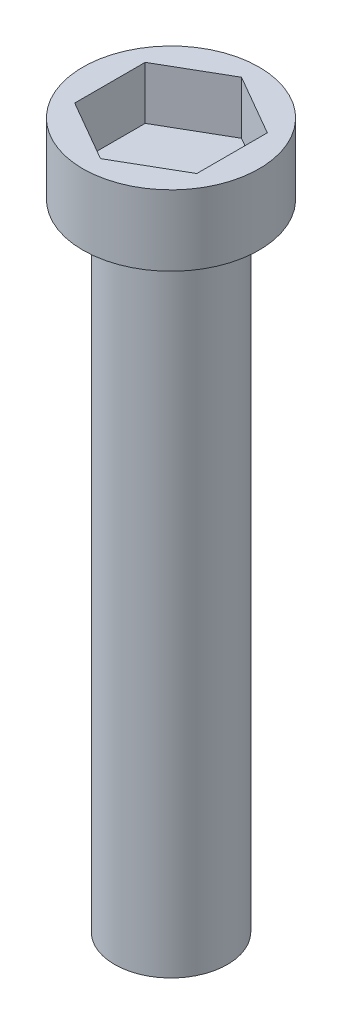
ISO-10303-21;
HEADER;
FILE_DESCRIPTION(('STEP AP214'),'2;1');
FILE_NAME('part.step','',(''),(''),'','','');
FILE_SCHEMA(('AUTOMOTIVE_DESIGN { 1 0 10303 214 1 1 1 1 }'));
ENDSEC;
DATA;
#1=APPLICATION_CONTEXT('core data for automotive mechanical design processes');
#2=APPLICATION_PROTOCOL_DEFINITION('international standard','automotive_design',2000,#1);
#3=PRODUCT_CONTEXT('',#1,'mechanical');
#4=PRODUCT('Part','Part','',(#3));
#5=PRODUCT_RELATED_PRODUCT_CATEGORY('part','',(#4));
#6=PRODUCT_DEFINITION_FORMATION('','',#4);
#7=PRODUCT_DEFINITION_CONTEXT('part definition',#1,'design');
#8=PRODUCT_DEFINITION('design','',#6,#7);
#9=PRODUCT_DEFINITION_SHAPE('','',#8);
#10=(LENGTH_UNIT() NAMED_UNIT(*) SI_UNIT(.MILLI.,.METRE.));
#11=(NAMED_UNIT(*) PLANE_ANGLE_UNIT() SI_UNIT($,.RADIAN.));
#12=(NAMED_UNIT(*) SI_UNIT($,.STERADIAN.) SOLID_ANGLE_UNIT());
#13=UNCERTAINTY_MEASURE_WITH_UNIT(LENGTH_MEASURE(1.E-05),#10,'distance_accuracy_value','');
#14=(GEOMETRIC_REPRESENTATION_CONTEXT(3) GLOBAL_UNCERTAINTY_ASSIGNED_CONTEXT((#13)) GLOBAL_UNIT_ASSIGNED_CONTEXT((#10,
#11,#12)) REPRESENTATION_CONTEXT('',''));
#15=CARTESIAN_POINT('',(0.,0.,0.));
#16=DIRECTION('',(0.,0.,1.));
#17=DIRECTION('',(1.,0.,0.));
#18=AXIS2_PLACEMENT_3D('',#15,#16,#17);
#19=CARTESIAN_POINT('',(0.,18.,0.));
#20=DIRECTION('',(0.,-1.,0.));
#21=DIRECTION('',(0.,0.,-1.));
#22=AXIS2_PLACEMENT_3D('',#19,#20,#21);
#23=CYLINDRICAL_SURFACE('',#22,1.6);
#24=CARTESIAN_POINT('',(0.,18.,0.));
#25=DIRECTION('',(0.,1.,0.));
#26=DIRECTION('',(0.,0.,1.));
#27=AXIS2_PLACEMENT_3D('',#24,#25,#26);
#28=CIRCLE('',#27,1.6);
#29=CARTESIAN_POINT('',(0.,18.,1.6));
#30=VERTEX_POINT('',#29);
#31=EDGE_CURVE('E11',#30,#30,#28,.T.);
#32=ORIENTED_EDGE('',*,*,#31,.F.);
#33=EDGE_LOOP('',(#32));
#34=FACE_BOUND('',#33,.T.);
#35=CARTESIAN_POINT('',(0.,0.,0.));
#36=DIRECTION('',(0.,1.,0.));
#37=DIRECTION('',(0.,0.,1.));
#38=AXIS2_PLACEMENT_3D('',#35,#36,#37);
#39=CIRCLE('',#38,1.6);
#40=CARTESIAN_POINT('',(0.,0.,1.6));
#41=VERTEX_POINT('',#40);
#42=EDGE_CURVE('E42',#41,#41,#39,.T.);
#43=ORIENTED_EDGE('',*,*,#42,.T.);
#44=EDGE_LOOP('',(#43));
#45=FACE_BOUND('',#44,.T.);
#46=ADVANCED_FACE('F39',(#34,#45),#23,.T.);
#47=CARTESIAN_POINT('',(0.,0.,0.));
#48=DIRECTION('',(0.,1.,0.));
#49=DIRECTION('',(0.,0.,1.));
#50=AXIS2_PLACEMENT_3D('',#47,#48,#49);
#51=PLANE('',#50);
#52=ORIENTED_EDGE('',*,*,#42,.F.);
#53=EDGE_LOOP('',(#52));
#54=FACE_BOUND('',#53,.T.);
#55=ADVANCED_FACE('F171',(#54),#51,.F.);
#56=CARTESIAN_POINT('',(0.,20.,0.));
#57=DIRECTION('',(0.,-1.,0.));
#58=DIRECTION('',(0.,0.,-1.));
#59=AXIS2_PLACEMENT_3D('',#56,#57,#58);
#60=CYLINDRICAL_SURFACE('',#59,2.5);
#61=CARTESIAN_POINT('',(0.,20.,0.));
#62=DIRECTION('',(0.,1.,0.));
#63=DIRECTION('',(0.,0.,1.));
#64=AXIS2_PLACEMENT_3D('',#61,#62,#63);
#65=CIRCLE('',#64,2.5);
#66=CARTESIAN_POINT('',(0.,20.,2.5));
#67=VERTEX_POINT('',#66);
#68=EDGE_CURVE('E146',#67,#67,#65,.T.);
#69=ORIENTED_EDGE('',*,*,#68,.F.);
#70=EDGE_LOOP('',(#69));
#71=FACE_BOUND('',#70,.T.);
#72=CARTESIAN_POINT('',(0.,18.,0.));
#73=DIRECTION('',(0.,1.,0.));
#74=DIRECTION('',(0.,0.,1.));
#75=AXIS2_PLACEMENT_3D('',#72,#73,#74);
#76=CIRCLE('',#75,2.5);
#77=CARTESIAN_POINT('',(0.,18.,2.5));
#78=VERTEX_POINT('',#77);
#79=EDGE_CURVE('E140',#78,#78,#76,.T.);
#80=ORIENTED_EDGE('',*,*,#79,.T.);
#81=EDGE_LOOP('',(#80));
#82=FACE_BOUND('',#81,.T.);
#83=ADVANCED_FACE('F152',(#71,#82),#60,.T.);
#84=CARTESIAN_POINT('',(0.,20.,0.));
#85=DIRECTION('',(0.,1.,0.));
#86=DIRECTION('',(0.,0.,1.));
#87=AXIS2_PLACEMENT_3D('',#84,#85,#86);
#88=PLANE('',#87);
#89=DIRECTION('',(-0.866025403784439,0.,-0.5));
#90=VECTOR('',#89,1.);
#91=CARTESIAN_POINT('',(1.73205080756888,20.,-1.));
#92=LINE('',#91,#90);
#93=CARTESIAN_POINT('',(1.73205080756888,20.,-1.));
#94=VERTEX_POINT('',#93);
#95=CARTESIAN_POINT('',(0.,20.,-2.));
#96=VERTEX_POINT('',#95);
#97=EDGE_CURVE('E53',#94,#96,#92,.T.);
#98=ORIENTED_EDGE('',*,*,#97,.F.);
#99=DIRECTION('',(0.,0.,-1.));
#100=VECTOR('',#99,1.);
#101=CARTESIAN_POINT('',(1.73205080756888,20.,1.));
#102=LINE('',#101,#100);
#103=CARTESIAN_POINT('',(1.73205080756888,20.,1.));
#104=VERTEX_POINT('',#103);
#105=EDGE_CURVE('E136',#104,#94,#102,.T.);
#106=ORIENTED_EDGE('',*,*,#105,.F.);
#107=DIRECTION('',(0.866025403784439,0.,-0.5));
#108=VECTOR('',#107,1.);
#109=CARTESIAN_POINT('',(0.,20.,2.));
#110=LINE('',#109,#108);
#111=CARTESIAN_POINT('',(0.,20.,2.));
#112=VERTEX_POINT('',#111);
#113=EDGE_CURVE('E134',#112,#104,#110,.T.);
#114=ORIENTED_EDGE('',*,*,#113,.F.);
#115=DIRECTION('',(0.866025403784439,0.,0.5));
#116=VECTOR('',#115,1.);
#117=CARTESIAN_POINT('',(-1.73205080756888,20.,1.));
#118=LINE('',#117,#116);
#119=CARTESIAN_POINT('',(-1.73205080756888,20.,1.));
#120=VERTEX_POINT('',#119);
#121=EDGE_CURVE('E101',#120,#112,#118,.T.);
#122=ORIENTED_EDGE('',*,*,#121,.F.);
#123=DIRECTION('',(0.,0.,1.));
#124=VECTOR('',#123,1.);
#125=CARTESIAN_POINT('',(-1.73205080756888,20.,-1.));
#126=LINE('',#125,#124);
#127=CARTESIAN_POINT('',(-1.73205080756888,20.,-1.));
#128=VERTEX_POINT('',#127);
#129=EDGE_CURVE('E130',#128,#120,#126,.T.);
#130=ORIENTED_EDGE('',*,*,#129,.F.);
#131=DIRECTION('',(-0.866025403784439,0.,0.5));
#132=VECTOR('',#131,1.);
#133=CARTESIAN_POINT('',(0.,20.,-2.));
#134=LINE('',#133,#132);
#135=EDGE_CURVE('E127',#96,#128,#134,.T.);
#136=ORIENTED_EDGE('',*,*,#135,.F.);
#137=EDGE_LOOP('',(#98,#106,#114,#122,#130,#136));
#138=FACE_BOUND('',#137,.T.);
#139=ORIENTED_EDGE('',*,*,#68,.T.);
#140=EDGE_LOOP('',(#139));
#141=FACE_BOUND('',#140,.T.);
#142=ADVANCED_FACE('F157',(#138,#141),#88,.T.);
#143=CARTESIAN_POINT('',(0.,18.,0.));
#144=DIRECTION('',(0.,1.,0.));
#145=DIRECTION('',(0.,0.,1.));
#146=AXIS2_PLACEMENT_3D('',#143,#144,#145);
#147=PLANE('',#146);
#148=ORIENTED_EDGE('',*,*,#31,.T.);
#149=EDGE_LOOP('',(#148));
#150=FACE_BOUND('',#149,.T.);
#151=ORIENTED_EDGE('',*,*,#79,.F.);
#152=EDGE_LOOP('',(#151));
#153=FACE_BOUND('',#152,.T.);
#154=ADVANCED_FACE('F154',(#150,#153),#147,.F.);
#155=CARTESIAN_POINT('',(1.73205080756888,18.5,-1.));
#156=DIRECTION('',(0.5,0.,-0.866025403784439));
#157=DIRECTION('',(-0.866025403784439,0.,-0.5));
#158=AXIS2_PLACEMENT_3D('',#155,#156,#157);
#159=PLANE('',#158);
#160=ORIENTED_EDGE('',*,*,#97,.T.);
#161=DIRECTION('',(0.,1.,0.));
#162=VECTOR('',#161,1.);
#163=CARTESIAN_POINT('',(0.,18.5,-2.));
#164=LINE('',#163,#162);
#165=CARTESIAN_POINT('',(0.,18.5,-2.));
#166=VERTEX_POINT('',#165);
#167=EDGE_CURVE('E83',#166,#96,#164,.T.);
#168=ORIENTED_EDGE('',*,*,#167,.F.);
#169=DIRECTION('',(-0.866025403784439,0.,-0.5));
#170=VECTOR('',#169,1.);
#171=CARTESIAN_POINT('',(1.73205080756888,18.5,-1.));
#172=LINE('',#171,#170);
#173=CARTESIAN_POINT('',(1.73205080756888,18.5,-1.));
#174=VERTEX_POINT('',#173);
#175=EDGE_CURVE('E138',#174,#166,#172,.T.);
#176=ORIENTED_EDGE('',*,*,#175,.F.);
#177=DIRECTION('',(0.,1.,0.));
#178=VECTOR('',#177,1.);
#179=CARTESIAN_POINT('',(1.73205080756888,18.5,-1.));
#180=LINE('',#179,#178);
#181=EDGE_CURVE('E61',#174,#94,#180,.T.);
#182=ORIENTED_EDGE('',*,*,#181,.T.);
#183=EDGE_LOOP('',(#160,#168,#176,#182));
#184=FACE_BOUND('',#183,.T.);
#185=ADVANCED_FACE('F156',(#184),#159,.F.);
#186=CARTESIAN_POINT('',(1.73205080756888,18.5,1.));
#187=DIRECTION('',(1.,0.,0.));
#188=DIRECTION('',(0.,0.,-1.));
#189=AXIS2_PLACEMENT_3D('',#186,#187,#188);
#190=PLANE('',#189);
#191=ORIENTED_EDGE('',*,*,#105,.T.);
#192=ORIENTED_EDGE('',*,*,#181,.F.);
#193=DIRECTION('',(0.,0.,-1.));
#194=VECTOR('',#193,1.);
#195=CARTESIAN_POINT('',(1.73205080756888,18.5,1.));
#196=LINE('',#195,#194);
#197=CARTESIAN_POINT('',(1.73205080756888,18.5,1.));
#198=VERTEX_POINT('',#197);
#199=EDGE_CURVE('E113',#198,#174,#196,.T.);
#200=ORIENTED_EDGE('',*,*,#199,.F.);
#201=DIRECTION('',(0.,1.,0.));
#202=VECTOR('',#201,1.);
#203=CARTESIAN_POINT('',(1.73205080756888,18.5,1.));
#204=LINE('',#203,#202);
#205=EDGE_CURVE('E105',#198,#104,#204,.T.);
#206=ORIENTED_EDGE('',*,*,#205,.T.);
#207=EDGE_LOOP('',(#191,#192,#200,#206));
#208=FACE_BOUND('',#207,.T.);
#209=ADVANCED_FACE('F165',(#208),#190,.F.);
#210=CARTESIAN_POINT('',(0.,18.5,2.));
#211=DIRECTION('',(0.5,0.,0.866025403784439));
#212=DIRECTION('',(0.866025403784439,0.,-0.5));
#213=AXIS2_PLACEMENT_3D('',#210,#211,#212);
#214=PLANE('',#213);
#215=ORIENTED_EDGE('',*,*,#113,.T.);
#216=ORIENTED_EDGE('',*,*,#205,.F.);
#217=DIRECTION('',(0.866025403784439,0.,-0.5));
#218=VECTOR('',#217,1.);
#219=CARTESIAN_POINT('',(0.,18.5,2.));
#220=LINE('',#219,#218);
#221=CARTESIAN_POINT('',(0.,18.5,2.));
#222=VERTEX_POINT('',#221);
#223=EDGE_CURVE('E109',#222,#198,#220,.T.);
#224=ORIENTED_EDGE('',*,*,#223,.F.);
#225=DIRECTION('',(0.,1.,0.));
#226=VECTOR('',#225,1.);
#227=CARTESIAN_POINT('',(0.,18.5,2.));
#228=LINE('',#227,#226);
#229=EDGE_CURVE('E94',#222,#112,#228,.T.);
#230=ORIENTED_EDGE('',*,*,#229,.T.);
#231=EDGE_LOOP('',(#215,#216,#224,#230));
#232=FACE_BOUND('',#231,.T.);
#233=ADVANCED_FACE('F110',(#232),#214,.F.);
#234=CARTESIAN_POINT('',(-1.73205080756888,18.5,1.));
#235=DIRECTION('',(-0.5,0.,0.866025403784439));
#236=DIRECTION('',(0.866025403784439,0.,0.5));
#237=AXIS2_PLACEMENT_3D('',#234,#235,#236);
#238=PLANE('',#237);
#239=ORIENTED_EDGE('',*,*,#121,.T.);
#240=ORIENTED_EDGE('',*,*,#229,.F.);
#241=DIRECTION('',(0.866025403784439,0.,0.5));
#242=VECTOR('',#241,1.);
#243=CARTESIAN_POINT('',(-1.73205080756888,18.5,1.));
#244=LINE('',#243,#242);
#245=CARTESIAN_POINT('',(-1.73205080756888,18.5,1.));
#246=VERTEX_POINT('',#245);
#247=EDGE_CURVE('E98',#246,#222,#244,.T.);
#248=ORIENTED_EDGE('',*,*,#247,.F.);
#249=DIRECTION('',(0.,1.,0.));
#250=VECTOR('',#249,1.);
#251=CARTESIAN_POINT('',(-1.73205080756888,18.5,1.));
#252=LINE('',#251,#250);
#253=EDGE_CURVE('E106',#246,#120,#252,.T.);
#254=ORIENTED_EDGE('',*,*,#253,.T.);
#255=EDGE_LOOP('',(#239,#240,#248,#254));
#256=FACE_BOUND('',#255,.T.);
#257=ADVANCED_FACE('F96',(#256),#238,.F.);
#258=CARTESIAN_POINT('',(-1.73205080756888,18.5,-1.));
#259=DIRECTION('',(-1.,0.,0.));
#260=DIRECTION('',(0.,0.,1.));
#261=AXIS2_PLACEMENT_3D('',#258,#259,#260);
#262=PLANE('',#261);
#263=ORIENTED_EDGE('',*,*,#129,.T.);
#264=ORIENTED_EDGE('',*,*,#253,.F.);
#265=DIRECTION('',(0.,0.,1.));
#266=VECTOR('',#265,1.);
#267=CARTESIAN_POINT('',(-1.73205080756888,18.5,-1.));
#268=LINE('',#267,#266);
#269=CARTESIAN_POINT('',(-1.73205080756888,18.5,-1.));
#270=VERTEX_POINT('',#269);
#271=EDGE_CURVE('E119',#270,#246,#268,.T.);
#272=ORIENTED_EDGE('',*,*,#271,.F.);
#273=DIRECTION('',(0.,1.,0.));
#274=VECTOR('',#273,1.);
#275=CARTESIAN_POINT('',(-1.73205080756888,18.5,-1.));
#276=LINE('',#275,#274);
#277=EDGE_CURVE('E143',#270,#128,#276,.T.);
#278=ORIENTED_EDGE('',*,*,#277,.T.);
#279=EDGE_LOOP('',(#263,#264,#272,#278));
#280=FACE_BOUND('',#279,.T.);
#281=ADVANCED_FACE('F233',(#280),#262,.F.);
#282=CARTESIAN_POINT('',(0.,18.5,-2.));
#283=DIRECTION('',(-0.5,0.,-0.866025403784438));
#284=DIRECTION('',(-0.866025403784439,0.,0.5));
#285=AXIS2_PLACEMENT_3D('',#282,#283,#284);
#286=PLANE('',#285);
#287=ORIENTED_EDGE('',*,*,#135,.T.);
#288=ORIENTED_EDGE('',*,*,#277,.F.);
#289=DIRECTION('',(-0.866025403784439,0.,0.5));
#290=VECTOR('',#289,1.);
#291=CARTESIAN_POINT('',(0.,18.5,-2.));
#292=LINE('',#291,#290);
#293=EDGE_CURVE('E121',#166,#270,#292,.T.);
#294=ORIENTED_EDGE('',*,*,#293,.F.);
#295=ORIENTED_EDGE('',*,*,#167,.T.);
#296=EDGE_LOOP('',(#287,#288,#294,#295));
#297=FACE_BOUND('',#296,.T.);
#298=ADVANCED_FACE('F242',(#297),#286,.F.);
#299=CARTESIAN_POINT('',(0.,18.5,0.));
#300=DIRECTION('',(0.,1.,0.));
#301=DIRECTION('',(0.,0.,1.));
#302=AXIS2_PLACEMENT_3D('',#299,#300,#301);
#303=PLANE('',#302);
#304=ORIENTED_EDGE('',*,*,#175,.T.);
#305=ORIENTED_EDGE('',*,*,#293,.T.);
#306=ORIENTED_EDGE('',*,*,#271,.T.);
#307=ORIENTED_EDGE('',*,*,#247,.T.);
#308=ORIENTED_EDGE('',*,*,#223,.T.);
#309=ORIENTED_EDGE('',*,*,#199,.T.);
#310=EDGE_LOOP('',(#304,#305,#306,#307,#308,#309));
#311=FACE_BOUND('',#310,.T.);
#312=ADVANCED_FACE('F116',(#311),#303,.T.);
#313=CLOSED_SHELL('',(#46,#55,#83,#142,#154,#185,#209,#233,#257,#281,#298,#312));
#314=MANIFOLD_SOLID_BREP('B2',#313);
#315=ADVANCED_BREP_SHAPE_REPRESENTATION('',(#18,#314),#14);
#316=SHAPE_DEFINITION_REPRESENTATION(#9,#315);
ENDSEC;
END-ISO-10303-21;
